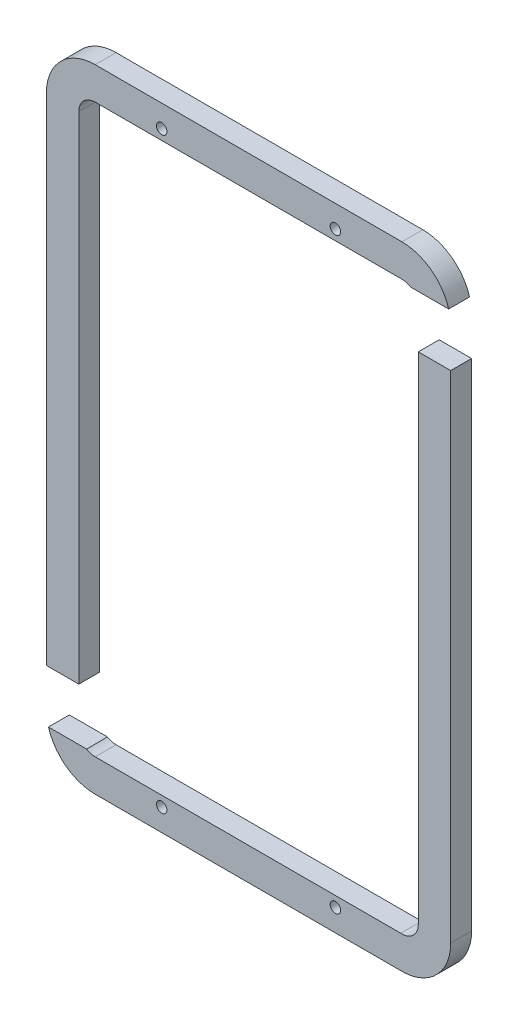
ISO-10303-21;
HEADER;
FILE_DESCRIPTION(('STEP AP214'),'2;1');
FILE_NAME('part.step','',(''),(''),'','','');
FILE_SCHEMA(('AUTOMOTIVE_DESIGN { 1 0 10303 214 1 1 1 1 }'));
ENDSEC;
DATA;
#1=APPLICATION_CONTEXT('core data for automotive mechanical design processes');
#2=APPLICATION_PROTOCOL_DEFINITION('international standard','automotive_design',2000,#1);
#3=PRODUCT_CONTEXT('',#1,'mechanical');
#4=PRODUCT('Part','Part','',(#3));
#5=PRODUCT_RELATED_PRODUCT_CATEGORY('part','',(#4));
#6=PRODUCT_DEFINITION_FORMATION('','',#4);
#7=PRODUCT_DEFINITION_CONTEXT('part definition',#1,'design');
#8=PRODUCT_DEFINITION('design','',#6,#7);
#9=PRODUCT_DEFINITION_SHAPE('','',#8);
#10=(LENGTH_UNIT() NAMED_UNIT(*) SI_UNIT(.MILLI.,.METRE.));
#11=(NAMED_UNIT(*) PLANE_ANGLE_UNIT() SI_UNIT($,.RADIAN.));
#12=(NAMED_UNIT(*) SI_UNIT($,.STERADIAN.) SOLID_ANGLE_UNIT());
#13=UNCERTAINTY_MEASURE_WITH_UNIT(LENGTH_MEASURE(1.E-05),#10,'distance_accuracy_value','');
#14=(GEOMETRIC_REPRESENTATION_CONTEXT(3) GLOBAL_UNCERTAINTY_ASSIGNED_CONTEXT((#13)) GLOBAL_UNIT_ASSIGNED_CONTEXT((#10,
#11,#12)) REPRESENTATION_CONTEXT('',''));
#15=CARTESIAN_POINT('',(0.,0.,0.));
#16=DIRECTION('',(0.,0.,1.));
#17=DIRECTION('',(1.,0.,0.));
#18=AXIS2_PLACEMENT_3D('',#15,#16,#17);
#19=CARTESIAN_POINT('',(0.,-81.3510841797015,6.));
#20=DIRECTION('',(0.,1.,0.));
#21=DIRECTION('',(0.,0.,1.));
#22=AXIS2_PLACEMENT_3D('',#19,#20,#21);
#23=PLANE('',#22);
#24=DIRECTION('',(1.,0.,0.));
#25=VECTOR('',#24,1.);
#26=CARTESIAN_POINT('',(0.,-81.3510841797015,0.));
#27=LINE('',#26,#25);
#28=CARTESIAN_POINT('',(-47.2228726483893,-81.3510841797015,0.));
#29=VERTEX_POINT('',#28);
#30=CARTESIAN_POINT('',(40.461175806316,-81.3510841797015,0.));
#31=VERTEX_POINT('',#30);
#32=EDGE_CURVE('E234',#29,#31,#27,.T.);
#33=ORIENTED_EDGE('',*,*,#32,.F.);
#34=DIRECTION('',(0.,0.,-1.));
#35=VECTOR('',#34,1.);
#36=CARTESIAN_POINT('',(-47.2228726483893,-81.3510841797015,6.));
#37=LINE('',#36,#35);
#38=CARTESIAN_POINT('',(-47.2228726483893,-81.3510841797015,6.));
#39=VERTEX_POINT('',#38);
#40=EDGE_CURVE('E13',#39,#29,#37,.T.);
#41=ORIENTED_EDGE('',*,*,#40,.F.);
#42=DIRECTION('',(1.,0.,0.));
#43=VECTOR('',#42,1.);
#44=CARTESIAN_POINT('',(0.,-81.3510841797015,6.));
#45=LINE('',#44,#43);
#46=CARTESIAN_POINT('',(40.461175806316,-81.3510841797015,6.));
#47=VERTEX_POINT('',#46);
#48=EDGE_CURVE('E323',#39,#47,#45,.T.);
#49=ORIENTED_EDGE('',*,*,#48,.T.);
#50=DIRECTION('',(0.,0.,-1.));
#51=VECTOR('',#50,1.);
#52=CARTESIAN_POINT('',(40.461175806316,-81.3510841797015,6.));
#53=LINE('',#52,#51);
#54=EDGE_CURVE('E129',#47,#31,#53,.T.);
#55=ORIENTED_EDGE('',*,*,#54,.T.);
#56=EDGE_LOOP('',(#33,#41,#49,#55));
#57=FACE_BOUND('',#56,.T.);
#58=ADVANCED_FACE('F111',(#57),#23,.T.);
#59=CARTESIAN_POINT('',(-47.2228744870842,-76.65,6.));
#60=DIRECTION('',(0.,0.,-1.));
#61=DIRECTION('',(-1.,0.,0.));
#62=AXIS2_PLACEMENT_3D('',#59,#60,#61);
#63=CYLINDRICAL_SURFACE('',#62,4.70108417970165);
#64=CARTESIAN_POINT('',(-47.2228744870842,-76.65,0.));
#65=DIRECTION('',(0.,0.,1.));
#66=DIRECTION('',(1.,0.,0.));
#67=AXIS2_PLACEMENT_3D('',#64,#65,#66);
#68=CIRCLE('',#67,4.70108417970165);
#69=CARTESIAN_POINT('',(-49.6927312571501,-80.6499999999999,0.));
#70=VERTEX_POINT('',#69);
#71=EDGE_CURVE('E237',#29,#70,#68,.F.);
#72=ORIENTED_EDGE('',*,*,#71,.T.);
#73=DIRECTION('',(0.,0.,-1.));
#74=VECTOR('',#73,1.);
#75=CARTESIAN_POINT('',(-49.6927312571501,-80.6499999999999,6.));
#76=LINE('',#75,#74);
#77=CARTESIAN_POINT('',(-49.6927312571501,-80.6499999999999,6.));
#78=VERTEX_POINT('',#77);
#79=EDGE_CURVE('E121',#78,#70,#76,.T.);
#80=ORIENTED_EDGE('',*,*,#79,.F.);
#81=CARTESIAN_POINT('',(-47.2228744870842,-76.65,6.));
#82=DIRECTION('',(0.,0.,1.));
#83=DIRECTION('',(1.,0.,0.));
#84=AXIS2_PLACEMENT_3D('',#81,#82,#83);
#85=CIRCLE('',#84,4.70108417970165);
#86=EDGE_CURVE('E316',#39,#78,#85,.F.);
#87=ORIENTED_EDGE('',*,*,#86,.F.);
#88=ORIENTED_EDGE('',*,*,#40,.T.);
#89=EDGE_LOOP('',(#72,#80,#87,#88));
#90=FACE_BOUND('',#89,.T.);
#91=ADVANCED_FACE('F302',(#90),#63,.F.);
#92=CARTESIAN_POINT('',(0.,-80.6499999999999,6.));
#93=DIRECTION('',(0.,1.,0.));
#94=DIRECTION('',(0.,0.,1.));
#95=AXIS2_PLACEMENT_3D('',#92,#93,#94);
#96=PLANE('',#95);
#97=DIRECTION('',(1.,0.,0.));
#98=VECTOR('',#97,1.);
#99=CARTESIAN_POINT('',(0.,-80.6499999999999,0.));
#100=LINE('',#99,#98);
#101=CARTESIAN_POINT('',(-60.639282352083,-80.6499999999999,0.));
#102=VERTEX_POINT('',#101);
#103=EDGE_CURVE('E241',#102,#70,#100,.T.);
#104=ORIENTED_EDGE('',*,*,#103,.F.);
#105=DIRECTION('',(0.,0.,-1.));
#106=VECTOR('',#105,1.);
#107=CARTESIAN_POINT('',(-60.639282352083,-80.6499999999999,6.));
#108=LINE('',#107,#106);
#109=CARTESIAN_POINT('',(-60.639282352083,-80.6499999999999,6.));
#110=VERTEX_POINT('',#109);
#111=EDGE_CURVE('E290',#110,#102,#108,.T.);
#112=ORIENTED_EDGE('',*,*,#111,.F.);
#113=DIRECTION('',(1.,0.,0.));
#114=VECTOR('',#113,1.);
#115=CARTESIAN_POINT('',(0.,-80.6499999999999,6.));
#116=LINE('',#115,#114);
#117=EDGE_CURVE('E299',#110,#78,#116,.T.);
#118=ORIENTED_EDGE('',*,*,#117,.T.);
#119=ORIENTED_EDGE('',*,*,#79,.T.);
#120=EDGE_LOOP('',(#104,#112,#118,#119));
#121=FACE_BOUND('',#120,.T.);
#122=ADVANCED_FACE('F297',(#121),#96,.T.);
#123=CARTESIAN_POINT('',(-47.2228744870842,-76.65,6.));
#124=DIRECTION('',(0.,0.,-1.));
#125=DIRECTION('',(-1.,0.,0.));
#126=AXIS2_PLACEMENT_3D('',#123,#124,#125);
#127=CYLINDRICAL_SURFACE('',#126,14.0000000000001);
#128=CARTESIAN_POINT('',(-47.2228744870842,-76.65,0.));
#129=DIRECTION('',(0.,0.,1.));
#130=DIRECTION('',(1.,0.,0.));
#131=AXIS2_PLACEMENT_3D('',#128,#129,#130);
#132=CIRCLE('',#131,14.0000000000001);
#133=CARTESIAN_POINT('',(-47.2228726483893,-90.65,0.));
#134=VERTEX_POINT('',#133);
#135=EDGE_CURVE('E245',#134,#102,#132,.F.);
#136=ORIENTED_EDGE('',*,*,#135,.F.);
#137=DIRECTION('',(0.,0.,-1.));
#138=VECTOR('',#137,1.);
#139=CARTESIAN_POINT('',(-47.2228726483893,-90.65,6.));
#140=LINE('',#139,#138);
#141=CARTESIAN_POINT('',(-47.2228726483893,-90.65,6.));
#142=VERTEX_POINT('',#141);
#143=EDGE_CURVE('E287',#142,#134,#140,.T.);
#144=ORIENTED_EDGE('',*,*,#143,.F.);
#145=CARTESIAN_POINT('',(-47.2228744870842,-76.65,6.));
#146=DIRECTION('',(0.,0.,1.));
#147=DIRECTION('',(1.,0.,0.));
#148=AXIS2_PLACEMENT_3D('',#145,#146,#147);
#149=CIRCLE('',#148,14.0000000000001);
#150=EDGE_CURVE('E313',#142,#110,#149,.F.);
#151=ORIENTED_EDGE('',*,*,#150,.T.);
#152=ORIENTED_EDGE('',*,*,#111,.T.);
#153=EDGE_LOOP('',(#136,#144,#151,#152));
#154=FACE_BOUND('',#153,.T.);
#155=ADVANCED_FACE('F310',(#154),#127,.T.);
#156=CARTESIAN_POINT('',(0.,-90.65,6.));
#157=DIRECTION('',(0.,-1.,0.));
#158=DIRECTION('',(0.,0.,-1.));
#159=AXIS2_PLACEMENT_3D('',#156,#157,#158);
#160=PLANE('',#159);
#161=DIRECTION('',(-1.,0.,0.));
#162=VECTOR('',#161,1.);
#163=CARTESIAN_POINT('',(0.,-90.65,0.));
#164=LINE('',#163,#162);
#165=CARTESIAN_POINT('',(40.2171273516172,-90.65,0.));
#166=VERTEX_POINT('',#165);
#167=EDGE_CURVE('E249',#166,#134,#164,.T.);
#168=ORIENTED_EDGE('',*,*,#167,.F.);
#169=DIRECTION('',(0.,0.,-1.));
#170=VECTOR('',#169,1.);
#171=CARTESIAN_POINT('',(40.2171273516172,-90.65,6.));
#172=LINE('',#171,#170);
#173=CARTESIAN_POINT('',(40.2171273516172,-90.65,6.));
#174=VERTEX_POINT('',#173);
#175=EDGE_CURVE('E284',#174,#166,#172,.T.);
#176=ORIENTED_EDGE('',*,*,#175,.F.);
#177=DIRECTION('',(-1.,0.,0.));
#178=VECTOR('',#177,1.);
#179=CARTESIAN_POINT('',(0.,-90.65,6.));
#180=LINE('',#179,#178);
#181=EDGE_CURVE('E321',#174,#142,#180,.T.);
#182=ORIENTED_EDGE('',*,*,#181,.T.);
#183=ORIENTED_EDGE('',*,*,#143,.T.);
#184=EDGE_LOOP('',(#168,#176,#182,#183));
#185=FACE_BOUND('',#184,.T.);
#186=ADVANCED_FACE('F357',(#185),#160,.T.);
#187=CARTESIAN_POINT('',(40.7971306725733,-76.6620195829536,6.));
#188=DIRECTION('',(0.,0.,-1.));
#189=DIRECTION('',(-1.,0.,0.));
#190=AXIS2_PLACEMENT_3D('',#187,#188,#189);
#191=CYLINDRICAL_SURFACE('',#190,13.9999999999998);
#192=CARTESIAN_POINT('',(40.7971306725733,-76.6620195829536,0.));
#193=DIRECTION('',(0.,0.,1.));
#194=DIRECTION('',(1.,0.,0.));
#195=AXIS2_PLACEMENT_3D('',#192,#193,#194);
#196=CIRCLE('',#195,13.9999999999998);
#197=CARTESIAN_POINT('',(54.7971255129158,-76.6499999999999,0.));
#198=VERTEX_POINT('',#197);
#199=EDGE_CURVE('E253',#166,#198,#196,.T.);
#200=ORIENTED_EDGE('',*,*,#199,.T.);
#201=DIRECTION('',(0.,0.,-1.));
#202=VECTOR('',#201,1.);
#203=CARTESIAN_POINT('',(54.7971255129158,-76.6499999999999,6.));
#204=LINE('',#203,#202);
#205=CARTESIAN_POINT('',(54.7971255129158,-76.6499999999999,6.));
#206=VERTEX_POINT('',#205);
#207=EDGE_CURVE('E281',#206,#198,#204,.T.);
#208=ORIENTED_EDGE('',*,*,#207,.F.);
#209=CARTESIAN_POINT('',(40.7971306725733,-76.6620195829536,6.));
#210=DIRECTION('',(0.,0.,1.));
#211=DIRECTION('',(1.,0.,0.));
#212=AXIS2_PLACEMENT_3D('',#209,#210,#211);
#213=CIRCLE('',#212,13.9999999999998);
#214=EDGE_CURVE('E220',#174,#206,#213,.T.);
#215=ORIENTED_EDGE('',*,*,#214,.F.);
#216=ORIENTED_EDGE('',*,*,#175,.T.);
#217=EDGE_LOOP('',(#200,#208,#215,#216));
#218=FACE_BOUND('',#217,.T.);
#219=ADVANCED_FACE('F332',(#218),#191,.T.);
#220=CARTESIAN_POINT('',(54.7971255129158,0.,6.));
#221=DIRECTION('',(1.,0.,0.));
#222=DIRECTION('',(0.,0.,-1.));
#223=AXIS2_PLACEMENT_3D('',#220,#221,#222);
#224=PLANE('',#223);
#225=DIRECTION('',(0.,-1.,0.));
#226=VECTOR('',#225,1.);
#227=CARTESIAN_POINT('',(54.7971255129158,0.,0.));
#228=LINE('',#227,#226);
#229=CARTESIAN_POINT('',(54.7971255129158,65.66,0.));
#230=VERTEX_POINT('',#229);
#231=EDGE_CURVE('E257',#230,#198,#228,.T.);
#232=ORIENTED_EDGE('',*,*,#231,.F.);
#233=DIRECTION('',(0.,0.,-1.));
#234=VECTOR('',#233,1.);
#235=CARTESIAN_POINT('',(54.7971255129158,65.66,6.));
#236=LINE('',#235,#234);
#237=CARTESIAN_POINT('',(54.7971255129158,65.66,6.));
#238=VERTEX_POINT('',#237);
#239=EDGE_CURVE('E202',#238,#230,#236,.T.);
#240=ORIENTED_EDGE('',*,*,#239,.F.);
#241=DIRECTION('',(0.,-1.,0.));
#242=VECTOR('',#241,1.);
#243=CARTESIAN_POINT('',(54.7971255129158,0.,6.));
#244=LINE('',#243,#242);
#245=EDGE_CURVE('E216',#238,#206,#244,.T.);
#246=ORIENTED_EDGE('',*,*,#245,.T.);
#247=ORIENTED_EDGE('',*,*,#207,.T.);
#248=EDGE_LOOP('',(#232,#240,#246,#247));
#249=FACE_BOUND('',#248,.T.);
#250=ADVANCED_FACE('F335',(#249),#224,.T.);
#251=CARTESIAN_POINT('',(0.,65.66,6.));
#252=DIRECTION('',(0.,1.,0.));
#253=DIRECTION('',(0.,0.,1.));
#254=AXIS2_PLACEMENT_3D('',#251,#252,#253);
#255=PLANE('',#254);
#256=DIRECTION('',(1.,0.,0.));
#257=VECTOR('',#256,1.);
#258=CARTESIAN_POINT('',(0.,65.66,0.));
#259=LINE('',#258,#257);
#260=CARTESIAN_POINT('',(45.4981994866049,65.66,0.));
#261=VERTEX_POINT('',#260);
#262=EDGE_CURVE('E198',#261,#230,#259,.T.);
#263=ORIENTED_EDGE('',*,*,#262,.F.);
#264=DIRECTION('',(0.,0.,-1.));
#265=VECTOR('',#264,1.);
#266=CARTESIAN_POINT('',(45.4981994866049,65.66,6.));
#267=LINE('',#266,#265);
#268=CARTESIAN_POINT('',(45.4981994866049,65.66,6.));
#269=VERTEX_POINT('',#268);
#270=EDGE_CURVE('E192',#269,#261,#267,.T.);
#271=ORIENTED_EDGE('',*,*,#270,.F.);
#272=DIRECTION('',(1.,0.,0.));
#273=VECTOR('',#272,1.);
#274=CARTESIAN_POINT('',(0.,65.66,6.));
#275=LINE('',#274,#273);
#276=EDGE_CURVE('E196',#269,#238,#275,.T.);
#277=ORIENTED_EDGE('',*,*,#276,.T.);
#278=ORIENTED_EDGE('',*,*,#239,.T.);
#279=EDGE_LOOP('',(#263,#271,#277,#278));
#280=FACE_BOUND('',#279,.T.);
#281=ADVANCED_FACE('F194',(#280),#255,.T.);
#282=CARTESIAN_POINT('',(45.498199486605,0.,6.));
#283=DIRECTION('',(1.,0.,0.));
#284=DIRECTION('',(0.,1.,0.));
#285=AXIS2_PLACEMENT_3D('',#282,#283,#284);
#286=PLANE('',#285);
#287=DIRECTION('',(0.,-1.,0.));
#288=VECTOR('',#287,1.);
#289=CARTESIAN_POINT('',(45.498199486605,0.,0.));
#290=LINE('',#289,#288);
#291=CARTESIAN_POINT('',(45.498199486605,-76.6499999999998,0.));
#292=VERTEX_POINT('',#291);
#293=EDGE_CURVE('E263',#261,#292,#290,.T.);
#294=ORIENTED_EDGE('',*,*,#293,.T.);
#295=DIRECTION('',(0.,0.,-1.));
#296=VECTOR('',#295,1.);
#297=CARTESIAN_POINT('',(45.498199486605,-76.6499999999998,6.));
#298=LINE('',#297,#296);
#299=CARTESIAN_POINT('',(45.498199486605,-76.6499999999998,6.));
#300=VERTEX_POINT('',#299);
#301=EDGE_CURVE('E161',#300,#292,#298,.T.);
#302=ORIENTED_EDGE('',*,*,#301,.F.);
#303=DIRECTION('',(0.,-1.,0.));
#304=VECTOR('',#303,1.);
#305=CARTESIAN_POINT('',(45.498199486605,0.,6.));
#306=LINE('',#305,#304);
#307=EDGE_CURVE('E204',#269,#300,#306,.T.);
#308=ORIENTED_EDGE('',*,*,#307,.F.);
#309=ORIENTED_EDGE('',*,*,#270,.T.);
#310=EDGE_LOOP('',(#294,#302,#308,#309));
#311=FACE_BOUND('',#310,.T.);
#312=ADVANCED_FACE('F205',(#311),#286,.F.);
#313=CARTESIAN_POINT('',(40.7971306725733,-76.6620195829536,6.));
#314=DIRECTION('',(0.,0.,-1.));
#315=DIRECTION('',(-1.,0.,0.));
#316=AXIS2_PLACEMENT_3D('',#313,#314,#315);
#317=CYLINDRICAL_SURFACE('',#316,4.70108417970116);
#318=CARTESIAN_POINT('',(40.7971306725733,-76.6620195829536,0.));
#319=DIRECTION('',(0.,0.,1.));
#320=DIRECTION('',(1.,0.,0.));
#321=AXIS2_PLACEMENT_3D('',#318,#319,#320);
#322=CIRCLE('',#321,4.70108417970116);
#323=EDGE_CURVE('E266',#31,#292,#322,.T.);
#324=ORIENTED_EDGE('',*,*,#323,.F.);
#325=ORIENTED_EDGE('',*,*,#54,.F.);
#326=CARTESIAN_POINT('',(40.7971306725733,-76.6620195829536,6.));
#327=DIRECTION('',(0.,0.,1.));
#328=DIRECTION('',(1.,0.,0.));
#329=AXIS2_PLACEMENT_3D('',#326,#327,#328);
#330=CIRCLE('',#329,4.70108417970116);
#331=EDGE_CURVE('E209',#47,#300,#330,.T.);
#332=ORIENTED_EDGE('',*,*,#331,.T.);
#333=ORIENTED_EDGE('',*,*,#301,.T.);
#334=EDGE_LOOP('',(#324,#325,#332,#333));
#335=FACE_BOUND('',#334,.T.);
#336=ADVANCED_FACE('F336',(#335),#317,.F.);
#337=CARTESIAN_POINT('',(-28.1428744870842,-84.31,6.));
#338=DIRECTION('',(0.,0.,-1.));
#339=DIRECTION('',(-1.,0.,0.));
#340=AXIS2_PLACEMENT_3D('',#337,#338,#339);
#341=CYLINDRICAL_SURFACE('',#340,1.5);
#342=CARTESIAN_POINT('',(-28.1428744870842,-84.31,6.));
#343=DIRECTION('',(0.,0.,1.));
#344=DIRECTION('',(1.,0.,0.));
#345=AXIS2_PLACEMENT_3D('',#342,#343,#344);
#346=CIRCLE('',#345,1.5);
#347=CARTESIAN_POINT('',(-26.6428744870842,-84.31,6.));
#348=VERTEX_POINT('',#347);
#349=EDGE_CURVE('E274',#348,#348,#346,.F.);
#350=ORIENTED_EDGE('',*,*,#349,.F.);
#351=EDGE_LOOP('',(#350));
#352=FACE_BOUND('',#351,.T.);
#353=CARTESIAN_POINT('',(-28.1428744870842,-84.31,0.));
#354=DIRECTION('',(0.,0.,1.));
#355=DIRECTION('',(1.,0.,0.));
#356=AXIS2_PLACEMENT_3D('',#353,#354,#355);
#357=CIRCLE('',#356,1.5);
#358=CARTESIAN_POINT('',(-26.6428744870842,-84.31,0.));
#359=VERTEX_POINT('',#358);
#360=EDGE_CURVE('E230',#359,#359,#357,.F.);
#361=ORIENTED_EDGE('',*,*,#360,.T.);
#362=EDGE_LOOP('',(#361));
#363=FACE_BOUND('',#362,.T.);
#364=ADVANCED_FACE('F113',(#352,#363),#341,.F.);
#365=CARTESIAN_POINT('',(21.7171255129158,-84.31,6.));
#366=DIRECTION('',(0.,0.,-1.));
#367=DIRECTION('',(-1.,0.,0.));
#368=AXIS2_PLACEMENT_3D('',#365,#366,#367);
#369=CYLINDRICAL_SURFACE('',#368,1.5);
#370=CARTESIAN_POINT('',(21.7171255129158,-84.31,6.));
#371=DIRECTION('',(0.,0.,1.));
#372=DIRECTION('',(1.,0.,0.));
#373=AXIS2_PLACEMENT_3D('',#370,#371,#372);
#374=CIRCLE('',#373,1.5);
#375=CARTESIAN_POINT('',(23.2171255129158,-84.31,6.));
#376=VERTEX_POINT('',#375);
#377=EDGE_CURVE('E226',#376,#376,#374,.F.);
#378=ORIENTED_EDGE('',*,*,#377,.F.);
#379=EDGE_LOOP('',(#378));
#380=FACE_BOUND('',#379,.T.);
#381=CARTESIAN_POINT('',(21.7171255129158,-84.31,0.));
#382=DIRECTION('',(0.,0.,1.));
#383=DIRECTION('',(1.,0.,0.));
#384=AXIS2_PLACEMENT_3D('',#381,#382,#383);
#385=CIRCLE('',#384,1.5);
#386=CARTESIAN_POINT('',(23.2171255129158,-84.31,0.));
#387=VERTEX_POINT('',#386);
#388=EDGE_CURVE('E270',#387,#387,#385,.F.);
#389=ORIENTED_EDGE('',*,*,#388,.T.);
#390=EDGE_LOOP('',(#389));
#391=FACE_BOUND('',#390,.T.);
#392=ADVANCED_FACE('F343',(#380,#391),#369,.F.);
#393=CARTESIAN_POINT('',(0.,0.,6.));
#394=DIRECTION('',(0.,0.,1.));
#395=DIRECTION('',(1.,0.,0.));
#396=AXIS2_PLACEMENT_3D('',#393,#394,#395);
#397=PLANE('',#396);
#398=ORIENTED_EDGE('',*,*,#349,.T.);
#399=EDGE_LOOP('',(#398));
#400=FACE_BOUND('',#399,.T.);
#401=ORIENTED_EDGE('',*,*,#48,.F.);
#402=ORIENTED_EDGE('',*,*,#86,.T.);
#403=ORIENTED_EDGE('',*,*,#117,.F.);
#404=ORIENTED_EDGE('',*,*,#150,.F.);
#405=ORIENTED_EDGE('',*,*,#181,.F.);
#406=ORIENTED_EDGE('',*,*,#214,.T.);
#407=ORIENTED_EDGE('',*,*,#245,.F.);
#408=ORIENTED_EDGE('',*,*,#276,.F.);
#409=ORIENTED_EDGE('',*,*,#307,.T.);
#410=ORIENTED_EDGE('',*,*,#331,.F.);
#411=EDGE_LOOP('',(#401,#402,#403,#404,#405,#406,#407,#408,#409,#410));
#412=FACE_BOUND('',#411,.T.);
#413=ORIENTED_EDGE('',*,*,#377,.T.);
#414=EDGE_LOOP('',(#413));
#415=FACE_BOUND('',#414,.T.);
#416=ADVANCED_FACE('F213',(#400,#412,#415),#397,.T.);
#417=CARTESIAN_POINT('',(0.,0.,0.));
#418=DIRECTION('',(0.,0.,1.));
#419=DIRECTION('',(1.,0.,0.));
#420=AXIS2_PLACEMENT_3D('',#417,#418,#419);
#421=PLANE('',#420);
#422=ORIENTED_EDGE('',*,*,#360,.F.);
#423=EDGE_LOOP('',(#422));
#424=FACE_BOUND('',#423,.T.);
#425=ORIENTED_EDGE('',*,*,#32,.T.);
#426=ORIENTED_EDGE('',*,*,#323,.T.);
#427=ORIENTED_EDGE('',*,*,#293,.F.);
#428=ORIENTED_EDGE('',*,*,#262,.T.);
#429=ORIENTED_EDGE('',*,*,#231,.T.);
#430=ORIENTED_EDGE('',*,*,#199,.F.);
#431=ORIENTED_EDGE('',*,*,#167,.T.);
#432=ORIENTED_EDGE('',*,*,#135,.T.);
#433=ORIENTED_EDGE('',*,*,#103,.T.);
#434=ORIENTED_EDGE('',*,*,#71,.F.);
#435=EDGE_LOOP('',(#425,#426,#427,#428,#429,#430,#431,#432,#433,#434));
#436=FACE_BOUND('',#435,.T.);
#437=ORIENTED_EDGE('',*,*,#388,.F.);
#438=EDGE_LOOP('',(#437));
#439=FACE_BOUND('',#438,.T.);
#440=ADVANCED_FACE('F304',(#424,#436,#439),#421,.F.);
#441=CLOSED_SHELL('',(#58,#91,#122,#155,#186,#219,#250,#281,#312,#336,#364,#392,#416,#440));
#442=MANIFOLD_SOLID_BREP('B2',#441);
#443=CARTESIAN_POINT('',(0.,81.3610739736891,6.));
#444=DIRECTION('',(0.,1.,0.));
#445=DIRECTION('',(-1.,0.,0.));
#446=AXIS2_PLACEMENT_3D('',#443,#444,#445);
#447=PLANE('',#446);
#448=DIRECTION('',(1.,0.,0.));
#449=VECTOR('',#448,1.);
#450=CARTESIAN_POINT('',(0.,81.3610739736891,0.));
#451=LINE('',#450,#449);
#452=CARTESIAN_POINT('',(-47.2228744870842,81.3610739736891,0.));
#453=VERTEX_POINT('',#452);
#454=CARTESIAN_POINT('',(40.7971255129158,81.3610739736891,0.));
#455=VERTEX_POINT('',#454);
#456=EDGE_CURVE('E582',#453,#455,#451,.T.);
#457=ORIENTED_EDGE('',*,*,#456,.T.);
#458=DIRECTION('',(0.,0.,-1.));
#459=VECTOR('',#458,1.);
#460=CARTESIAN_POINT('',(40.7971255129158,81.3610739736891,6.));
#461=LINE('',#460,#459);
#462=CARTESIAN_POINT('',(40.7971255129158,81.3610739736891,6.));
#463=VERTEX_POINT('',#462);
#464=EDGE_CURVE('E109',#463,#455,#461,.T.);
#465=ORIENTED_EDGE('',*,*,#464,.F.);
#466=DIRECTION('',(1.,0.,0.));
#467=VECTOR('',#466,1.);
#468=CARTESIAN_POINT('',(0.,81.3610739736891,6.));
#469=LINE('',#468,#467);
#470=CARTESIAN_POINT('',(-47.2228744870842,81.3610739736891,6.));
#471=VERTEX_POINT('',#470);
#472=EDGE_CURVE('E650',#471,#463,#469,.T.);
#473=ORIENTED_EDGE('',*,*,#472,.F.);
#474=DIRECTION('',(0.,0.,-1.));
#475=VECTOR('',#474,1.);
#476=CARTESIAN_POINT('',(-47.2228744870842,81.3610739736891,6.));
#477=LINE('',#476,#475);
#478=EDGE_CURVE('E572',#471,#453,#477,.T.);
#479=ORIENTED_EDGE('',*,*,#478,.T.);
#480=EDGE_LOOP('',(#457,#465,#473,#479));
#481=FACE_BOUND('',#480,.T.);
#482=ADVANCED_FACE('F467',(#481),#447,.F.);
#483=CARTESIAN_POINT('',(40.7971255129158,76.66,6.));
#484=DIRECTION('',(0.,0.,-1.));
#485=DIRECTION('',(-1.,0.,0.));
#486=AXIS2_PLACEMENT_3D('',#483,#484,#485);
#487=CYLINDRICAL_SURFACE('',#486,4.70107397368915);
#488=CARTESIAN_POINT('',(40.7971255129158,76.66,0.));
#489=DIRECTION('',(0.,0.,1.));
#490=DIRECTION('',(1.,0.,0.));
#491=AXIS2_PLACEMENT_3D('',#488,#489,#490);
#492=CIRCLE('',#491,4.70107397368915);
#493=CARTESIAN_POINT('',(43.2669628569726,80.66,0.));
#494=VERTEX_POINT('',#493);
#495=EDGE_CURVE('E585',#455,#494,#492,.F.);
#496=ORIENTED_EDGE('',*,*,#495,.T.);
#497=DIRECTION('',(0.,0.,-1.));
#498=VECTOR('',#497,1.);
#499=CARTESIAN_POINT('',(43.2669628569726,80.66,6.));
#500=LINE('',#499,#498);
#501=CARTESIAN_POINT('',(43.2669628569726,80.66,6.));
#502=VERTEX_POINT('',#501);
#503=EDGE_CURVE('E476',#502,#494,#500,.T.);
#504=ORIENTED_EDGE('',*,*,#503,.F.);
#505=CARTESIAN_POINT('',(40.7971255129158,76.66,6.));
#506=DIRECTION('',(0.,0.,1.));
#507=DIRECTION('',(1.,0.,0.));
#508=AXIS2_PLACEMENT_3D('',#505,#506,#507);
#509=CIRCLE('',#508,4.70107397368915);
#510=EDGE_CURVE('E533',#463,#502,#509,.F.);
#511=ORIENTED_EDGE('',*,*,#510,.F.);
#512=ORIENTED_EDGE('',*,*,#464,.T.);
#513=EDGE_LOOP('',(#496,#504,#511,#512));
#514=FACE_BOUND('',#513,.T.);
#515=ADVANCED_FACE('F665',(#514),#487,.F.);
#516=CARTESIAN_POINT('',(0.,80.66,6.));
#517=DIRECTION('',(0.,1.,0.));
#518=DIRECTION('',(0.,0.,1.));
#519=AXIS2_PLACEMENT_3D('',#516,#517,#518);
#520=PLANE('',#519);
#521=DIRECTION('',(1.,0.,0.));
#522=VECTOR('',#521,1.);
#523=CARTESIAN_POINT('',(0.,80.66,0.));
#524=LINE('',#523,#522);
#525=CARTESIAN_POINT('',(54.2135333779145,80.66,0.));
#526=VERTEX_POINT('',#525);
#527=EDGE_CURVE('E587',#494,#526,#524,.T.);
#528=ORIENTED_EDGE('',*,*,#527,.T.);
#529=DIRECTION('',(0.,0.,-1.));
#530=VECTOR('',#529,1.);
#531=CARTESIAN_POINT('',(54.2135333779145,80.66,6.));
#532=LINE('',#531,#530);
#533=CARTESIAN_POINT('',(54.2135333779145,80.66,6.));
#534=VERTEX_POINT('',#533);
#535=EDGE_CURVE('E615',#534,#526,#532,.T.);
#536=ORIENTED_EDGE('',*,*,#535,.F.);
#537=DIRECTION('',(1.,0.,0.));
#538=VECTOR('',#537,1.);
#539=CARTESIAN_POINT('',(0.,80.66,6.));
#540=LINE('',#539,#538);
#541=EDGE_CURVE('E622',#502,#534,#540,.T.);
#542=ORIENTED_EDGE('',*,*,#541,.F.);
#543=ORIENTED_EDGE('',*,*,#503,.T.);
#544=EDGE_LOOP('',(#528,#536,#542,#543));
#545=FACE_BOUND('',#544,.T.);
#546=ADVANCED_FACE('F620',(#545),#520,.F.);
#547=CARTESIAN_POINT('',(40.7971255129158,76.66,6.));
#548=DIRECTION('',(0.,0.,-1.));
#549=DIRECTION('',(-1.,0.,0.));
#550=AXIS2_PLACEMENT_3D('',#547,#548,#549);
#551=CYLINDRICAL_SURFACE('',#550,14.);
#552=CARTESIAN_POINT('',(40.7971255129158,76.66,0.));
#553=DIRECTION('',(0.,0.,1.));
#554=DIRECTION('',(1.,0.,0.));
#555=AXIS2_PLACEMENT_3D('',#552,#553,#554);
#556=CIRCLE('',#555,14.);
#557=CARTESIAN_POINT('',(40.7971255129158,90.66,0.));
#558=VERTEX_POINT('',#557);
#559=EDGE_CURVE('E590',#558,#526,#556,.F.);
#560=ORIENTED_EDGE('',*,*,#559,.F.);
#561=DIRECTION('',(0.,0.,-1.));
#562=VECTOR('',#561,1.);
#563=CARTESIAN_POINT('',(40.7971255129158,90.66,6.));
#564=LINE('',#563,#562);
#565=CARTESIAN_POINT('',(40.7971255129158,90.66,6.));
#566=VERTEX_POINT('',#565);
#567=EDGE_CURVE('E613',#566,#558,#564,.T.);
#568=ORIENTED_EDGE('',*,*,#567,.F.);
#569=CARTESIAN_POINT('',(40.7971255129158,76.66,6.));
#570=DIRECTION('',(0.,0.,1.));
#571=DIRECTION('',(1.,0.,0.));
#572=AXIS2_PLACEMENT_3D('',#569,#570,#571);
#573=CIRCLE('',#572,14.);
#574=EDGE_CURVE('E632',#566,#534,#573,.F.);
#575=ORIENTED_EDGE('',*,*,#574,.T.);
#576=ORIENTED_EDGE('',*,*,#535,.T.);
#577=EDGE_LOOP('',(#560,#568,#575,#576));
#578=FACE_BOUND('',#577,.T.);
#579=ADVANCED_FACE('F629',(#578),#551,.T.);
#580=CARTESIAN_POINT('',(0.,90.66,6.));
#581=DIRECTION('',(0.,1.,0.));
#582=DIRECTION('',(-1.,0.,0.));
#583=AXIS2_PLACEMENT_3D('',#580,#581,#582);
#584=PLANE('',#583);
#585=DIRECTION('',(1.,0.,0.));
#586=VECTOR('',#585,1.);
#587=CARTESIAN_POINT('',(0.,90.66,0.));
#588=LINE('',#587,#586);
#589=CARTESIAN_POINT('',(-47.2228744870842,90.66,0.));
#590=VERTEX_POINT('',#589);
#591=EDGE_CURVE('E593',#590,#558,#588,.T.);
#592=ORIENTED_EDGE('',*,*,#591,.F.);
#593=DIRECTION('',(0.,0.,-1.));
#594=VECTOR('',#593,1.);
#595=CARTESIAN_POINT('',(-47.2228744870842,90.66,6.));
#596=LINE('',#595,#594);
#597=CARTESIAN_POINT('',(-47.2228744870842,90.66,6.));
#598=VERTEX_POINT('',#597);
#599=EDGE_CURVE('E611',#598,#590,#596,.T.);
#600=ORIENTED_EDGE('',*,*,#599,.F.);
#601=DIRECTION('',(1.,0.,0.));
#602=VECTOR('',#601,1.);
#603=CARTESIAN_POINT('',(0.,90.66,6.));
#604=LINE('',#603,#602);
#605=EDGE_CURVE('E635',#598,#566,#604,.T.);
#606=ORIENTED_EDGE('',*,*,#605,.T.);
#607=ORIENTED_EDGE('',*,*,#567,.T.);
#608=EDGE_LOOP('',(#592,#600,#606,#607));
#609=FACE_BOUND('',#608,.T.);
#610=ADVANCED_FACE('F739',(#609),#584,.T.);
#611=CARTESIAN_POINT('',(-47.2228744870842,76.66,6.));
#612=DIRECTION('',(0.,0.,-1.));
#613=DIRECTION('',(-1.,0.,0.));
#614=AXIS2_PLACEMENT_3D('',#611,#612,#613);
#615=CYLINDRICAL_SURFACE('',#614,14.);
#616=CARTESIAN_POINT('',(-47.2228744870842,76.66,0.));
#617=DIRECTION('',(0.,0.,1.));
#618=DIRECTION('',(1.,0.,0.));
#619=AXIS2_PLACEMENT_3D('',#616,#617,#618);
#620=CIRCLE('',#619,14.);
#621=CARTESIAN_POINT('',(-61.2228744870842,76.66,0.));
#622=VERTEX_POINT('',#621);
#623=EDGE_CURVE('E596',#622,#590,#620,.F.);
#624=ORIENTED_EDGE('',*,*,#623,.F.);
#625=DIRECTION('',(0.,0.,-1.));
#626=VECTOR('',#625,1.);
#627=CARTESIAN_POINT('',(-61.2228744870842,76.66,6.));
#628=LINE('',#627,#626);
#629=CARTESIAN_POINT('',(-61.2228744870842,76.66,6.));
#630=VERTEX_POINT('',#629);
#631=EDGE_CURVE('E609',#630,#622,#628,.T.);
#632=ORIENTED_EDGE('',*,*,#631,.F.);
#633=CARTESIAN_POINT('',(-47.2228744870842,76.66,6.));
#634=DIRECTION('',(0.,0.,1.));
#635=DIRECTION('',(1.,0.,0.));
#636=AXIS2_PLACEMENT_3D('',#633,#634,#635);
#637=CIRCLE('',#636,14.);
#638=EDGE_CURVE('E637',#630,#598,#637,.F.);
#639=ORIENTED_EDGE('',*,*,#638,.T.);
#640=ORIENTED_EDGE('',*,*,#599,.T.);
#641=EDGE_LOOP('',(#624,#632,#639,#640));
#642=FACE_BOUND('',#641,.T.);
#643=ADVANCED_FACE('F730',(#642),#615,.T.);
#644=CARTESIAN_POINT('',(-61.2228744870842,0.,6.));
#645=DIRECTION('',(-1.,0.,0.));
#646=DIRECTION('',(0.,0.,1.));
#647=AXIS2_PLACEMENT_3D('',#644,#645,#646);
#648=PLANE('',#647);
#649=DIRECTION('',(0.,1.,0.));
#650=VECTOR('',#649,1.);
#651=CARTESIAN_POINT('',(-61.2228744870842,0.,0.));
#652=LINE('',#651,#650);
#653=CARTESIAN_POINT('',(-61.2228744870842,-65.65,0.));
#654=VERTEX_POINT('',#653);
#655=EDGE_CURVE('E599',#654,#622,#652,.T.);
#656=ORIENTED_EDGE('',*,*,#655,.F.);
#657=DIRECTION('',(0.,0.,-1.));
#658=VECTOR('',#657,1.);
#659=CARTESIAN_POINT('',(-61.2228744870842,-65.65,6.));
#660=LINE('',#659,#658);
#661=CARTESIAN_POINT('',(-61.2228744870842,-65.65,6.));
#662=VERTEX_POINT('',#661);
#663=EDGE_CURVE('E567',#662,#654,#660,.T.);
#664=ORIENTED_EDGE('',*,*,#663,.F.);
#665=DIRECTION('',(0.,1.,0.));
#666=VECTOR('',#665,1.);
#667=CARTESIAN_POINT('',(-61.2228744870842,0.,6.));
#668=LINE('',#667,#666);
#669=EDGE_CURVE('E560',#662,#630,#668,.T.);
#670=ORIENTED_EDGE('',*,*,#669,.T.);
#671=ORIENTED_EDGE('',*,*,#631,.T.);
#672=EDGE_LOOP('',(#656,#664,#670,#671));
#673=FACE_BOUND('',#672,.T.);
#674=ADVANCED_FACE('F645',(#673),#648,.T.);
#675=CARTESIAN_POINT('',(0.,-65.65,6.));
#676=DIRECTION('',(0.,1.,0.));
#677=DIRECTION('',(0.,0.,1.));
#678=AXIS2_PLACEMENT_3D('',#675,#676,#677);
#679=PLANE('',#678);
#680=DIRECTION('',(1.,0.,0.));
#681=VECTOR('',#680,1.);
#682=CARTESIAN_POINT('',(0.,-65.65,0.));
#683=LINE('',#682,#681);
#684=CARTESIAN_POINT('',(-51.9239484607734,-65.65,0.));
#685=VERTEX_POINT('',#684);
#686=EDGE_CURVE('E566',#654,#685,#683,.T.);
#687=ORIENTED_EDGE('',*,*,#686,.T.);
#688=DIRECTION('',(0.,0.,-1.));
#689=VECTOR('',#688,1.);
#690=CARTESIAN_POINT('',(-51.9239484607734,-65.65,6.));
#691=LINE('',#690,#689);
#692=CARTESIAN_POINT('',(-51.9239484607734,-65.65,6.));
#693=VERTEX_POINT('',#692);
#694=EDGE_CURVE('E563',#693,#685,#691,.T.);
#695=ORIENTED_EDGE('',*,*,#694,.F.);
#696=DIRECTION('',(1.,0.,0.));
#697=VECTOR('',#696,1.);
#698=CARTESIAN_POINT('',(0.,-65.65,6.));
#699=LINE('',#698,#697);
#700=EDGE_CURVE('E553',#662,#693,#699,.T.);
#701=ORIENTED_EDGE('',*,*,#700,.F.);
#702=ORIENTED_EDGE('',*,*,#663,.T.);
#703=EDGE_LOOP('',(#687,#695,#701,#702));
#704=FACE_BOUND('',#703,.T.);
#705=ADVANCED_FACE('F564',(#704),#679,.F.);
#706=CARTESIAN_POINT('',(-51.9239484607734,0.,6.));
#707=DIRECTION('',(-1.,0.,0.));
#708=DIRECTION('',(0.,0.,1.));
#709=AXIS2_PLACEMENT_3D('',#706,#707,#708);
#710=PLANE('',#709);
#711=DIRECTION('',(0.,1.,0.));
#712=VECTOR('',#711,1.);
#713=CARTESIAN_POINT('',(-51.9239484607734,0.,0.));
#714=LINE('',#713,#712);
#715=CARTESIAN_POINT('',(-51.9239484607734,76.66,0.));
#716=VERTEX_POINT('',#715);
#717=EDGE_CURVE('E519',#685,#716,#714,.T.);
#718=ORIENTED_EDGE('',*,*,#717,.T.);
#719=DIRECTION('',(0.,0.,-1.));
#720=VECTOR('',#719,1.);
#721=CARTESIAN_POINT('',(-51.9239484607734,76.66,6.));
#722=LINE('',#721,#720);
#723=CARTESIAN_POINT('',(-51.9239484607734,76.66,6.));
#724=VERTEX_POINT('',#723);
#725=EDGE_CURVE('E568',#724,#716,#722,.T.);
#726=ORIENTED_EDGE('',*,*,#725,.F.);
#727=DIRECTION('',(0.,1.,0.));
#728=VECTOR('',#727,1.);
#729=CARTESIAN_POINT('',(-51.9239484607734,0.,6.));
#730=LINE('',#729,#728);
#731=EDGE_CURVE('E557',#693,#724,#730,.T.);
#732=ORIENTED_EDGE('',*,*,#731,.F.);
#733=ORIENTED_EDGE('',*,*,#694,.T.);
#734=EDGE_LOOP('',(#718,#726,#732,#733));
#735=FACE_BOUND('',#734,.T.);
#736=ADVANCED_FACE('F570',(#735),#710,.F.);
#737=CARTESIAN_POINT('',(21.7171255129158,84.31,6.));
#738=DIRECTION('',(0.,0.,-1.));
#739=DIRECTION('',(-1.,0.,0.));
#740=AXIS2_PLACEMENT_3D('',#737,#738,#739);
#741=CYLINDRICAL_SURFACE('',#740,1.5);
#742=CARTESIAN_POINT('',(21.7171255129158,84.31,6.));
#743=DIRECTION('',(0.,0.,1.));
#744=DIRECTION('',(1.,0.,0.));
#745=AXIS2_PLACEMENT_3D('',#742,#743,#744);
#746=CIRCLE('',#745,1.5);
#747=CARTESIAN_POINT('',(23.2171255129158,84.31,6.));
#748=VERTEX_POINT('',#747);
#749=EDGE_CURVE('E680',#748,#748,#746,.T.);
#750=ORIENTED_EDGE('',*,*,#749,.T.);
#751=EDGE_LOOP('',(#750));
#752=FACE_BOUND('',#751,.T.);
#753=CARTESIAN_POINT('',(21.7171255129158,84.31,0.));
#754=DIRECTION('',(0.,0.,1.));
#755=DIRECTION('',(1.,0.,0.));
#756=AXIS2_PLACEMENT_3D('',#753,#754,#755);
#757=CIRCLE('',#756,1.5);
#758=CARTESIAN_POINT('',(23.2171255129158,84.31,0.));
#759=VERTEX_POINT('',#758);
#760=EDGE_CURVE('E579',#759,#759,#757,.T.);
#761=ORIENTED_EDGE('',*,*,#760,.F.);
#762=EDGE_LOOP('',(#761));
#763=FACE_BOUND('',#762,.T.);
#764=ADVANCED_FACE('F660',(#752,#763),#741,.F.);
#765=CARTESIAN_POINT('',(-28.1428744870842,84.31,6.));
#766=DIRECTION('',(0.,0.,-1.));
#767=DIRECTION('',(-1.,0.,0.));
#768=AXIS2_PLACEMENT_3D('',#765,#766,#767);
#769=CYLINDRICAL_SURFACE('',#768,1.5);
#770=CARTESIAN_POINT('',(-28.1428744870842,84.31,6.));
#771=DIRECTION('',(0.,0.,1.));
#772=DIRECTION('',(1.,0.,0.));
#773=AXIS2_PLACEMENT_3D('',#770,#771,#772);
#774=CIRCLE('',#773,1.5);
#775=CARTESIAN_POINT('',(-26.6428744870842,84.31,6.));
#776=VERTEX_POINT('',#775);
#777=EDGE_CURVE('E605',#776,#776,#774,.T.);
#778=ORIENTED_EDGE('',*,*,#777,.T.);
#779=EDGE_LOOP('',(#778));
#780=FACE_BOUND('',#779,.T.);
#781=CARTESIAN_POINT('',(-28.1428744870842,84.31,0.));
#782=DIRECTION('',(0.,0.,1.));
#783=DIRECTION('',(1.,0.,0.));
#784=AXIS2_PLACEMENT_3D('',#781,#782,#783);
#785=CIRCLE('',#784,1.5);
#786=CARTESIAN_POINT('',(-26.6428744870842,84.31,0.));
#787=VERTEX_POINT('',#786);
#788=EDGE_CURVE('E576',#787,#787,#785,.T.);
#789=ORIENTED_EDGE('',*,*,#788,.F.);
#790=EDGE_LOOP('',(#789));
#791=FACE_BOUND('',#790,.T.);
#792=ADVANCED_FACE('F469',(#780,#791),#769,.F.);
#793=CARTESIAN_POINT('',(-47.2228744870842,76.66,6.));
#794=DIRECTION('',(0.,0.,-1.));
#795=DIRECTION('',(-1.,0.,0.));
#796=AXIS2_PLACEMENT_3D('',#793,#794,#795);
#797=CYLINDRICAL_SURFACE('',#796,4.70107397368915);
#798=CARTESIAN_POINT('',(-47.2228744870842,76.66,0.));
#799=DIRECTION('',(0.,0.,1.));
#800=DIRECTION('',(1.,0.,0.));
#801=AXIS2_PLACEMENT_3D('',#798,#799,#800);
#802=CIRCLE('',#801,4.70107397368915);
#803=EDGE_CURVE('E525',#716,#453,#802,.F.);
#804=ORIENTED_EDGE('',*,*,#803,.T.);
#805=ORIENTED_EDGE('',*,*,#478,.F.);
#806=CARTESIAN_POINT('',(-47.2228744870842,76.66,6.));
#807=DIRECTION('',(0.,0.,1.));
#808=DIRECTION('',(1.,0.,0.));
#809=AXIS2_PLACEMENT_3D('',#806,#807,#808);
#810=CIRCLE('',#809,4.70107397368915);
#811=EDGE_CURVE('E484',#724,#471,#810,.F.);
#812=ORIENTED_EDGE('',*,*,#811,.F.);
#813=ORIENTED_EDGE('',*,*,#725,.T.);
#814=EDGE_LOOP('',(#804,#805,#812,#813));
#815=FACE_BOUND('',#814,.T.);
#816=ADVANCED_FACE('F651',(#815),#797,.F.);
#817=CARTESIAN_POINT('',(0.,0.,6.));
#818=DIRECTION('',(0.,0.,1.));
#819=DIRECTION('',(1.,0.,0.));
#820=AXIS2_PLACEMENT_3D('',#817,#818,#819);
#821=PLANE('',#820);
#822=ORIENTED_EDGE('',*,*,#777,.F.);
#823=EDGE_LOOP('',(#822));
#824=FACE_BOUND('',#823,.T.);
#825=ORIENTED_EDGE('',*,*,#749,.F.);
#826=EDGE_LOOP('',(#825));
#827=FACE_BOUND('',#826,.T.);
#828=ORIENTED_EDGE('',*,*,#472,.T.);
#829=ORIENTED_EDGE('',*,*,#510,.T.);
#830=ORIENTED_EDGE('',*,*,#541,.T.);
#831=ORIENTED_EDGE('',*,*,#574,.F.);
#832=ORIENTED_EDGE('',*,*,#605,.F.);
#833=ORIENTED_EDGE('',*,*,#638,.F.);
#834=ORIENTED_EDGE('',*,*,#669,.F.);
#835=ORIENTED_EDGE('',*,*,#700,.T.);
#836=ORIENTED_EDGE('',*,*,#731,.T.);
#837=ORIENTED_EDGE('',*,*,#811,.T.);
#838=EDGE_LOOP('',(#828,#829,#830,#831,#832,#833,#834,#835,#836,#837));
#839=FACE_BOUND('',#838,.T.);
#840=ADVANCED_FACE('F555',(#824,#827,#839),#821,.T.);
#841=CARTESIAN_POINT('',(0.,0.,0.));
#842=DIRECTION('',(0.,0.,1.));
#843=DIRECTION('',(1.,0.,0.));
#844=AXIS2_PLACEMENT_3D('',#841,#842,#843);
#845=PLANE('',#844);
#846=ORIENTED_EDGE('',*,*,#788,.T.);
#847=EDGE_LOOP('',(#846));
#848=FACE_BOUND('',#847,.T.);
#849=ORIENTED_EDGE('',*,*,#760,.T.);
#850=EDGE_LOOP('',(#849));
#851=FACE_BOUND('',#850,.T.);
#852=ORIENTED_EDGE('',*,*,#456,.F.);
#853=ORIENTED_EDGE('',*,*,#803,.F.);
#854=ORIENTED_EDGE('',*,*,#717,.F.);
#855=ORIENTED_EDGE('',*,*,#686,.F.);
#856=ORIENTED_EDGE('',*,*,#655,.T.);
#857=ORIENTED_EDGE('',*,*,#623,.T.);
#858=ORIENTED_EDGE('',*,*,#591,.T.);
#859=ORIENTED_EDGE('',*,*,#559,.T.);
#860=ORIENTED_EDGE('',*,*,#527,.F.);
#861=ORIENTED_EDGE('',*,*,#495,.F.);
#862=EDGE_LOOP('',(#852,#853,#854,#855,#856,#857,#858,#859,#860,#861));
#863=FACE_BOUND('',#862,.T.);
#864=ADVANCED_FACE('F625',(#848,#851,#863),#845,.F.);
#865=CLOSED_SHELL('',(#482,#515,#546,#579,#610,#643,#674,#705,#736,#764,#792,#816,#840,#864));
#866=MANIFOLD_SOLID_BREP('B7',#865);
#867=ADVANCED_BREP_SHAPE_REPRESENTATION('',(#18,#442,#866),#14);
#868=SHAPE_DEFINITION_REPRESENTATION(#9,#867);
ENDSEC;
END-ISO-10303-21;
